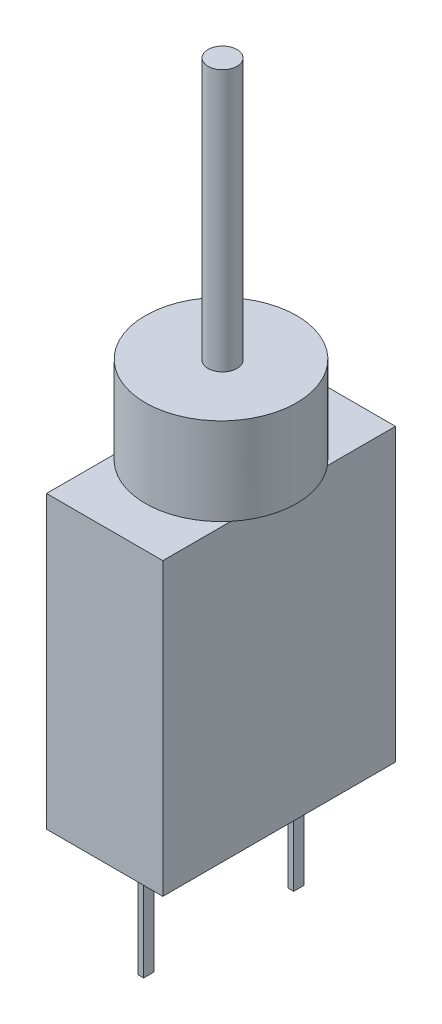
ISO-10303-21;
HEADER;
FILE_DESCRIPTION(('STEP AP214'),'2;1');
FILE_NAME('part.step','',(''),(''),'','','');
FILE_SCHEMA(('AUTOMOTIVE_DESIGN { 1 0 10303 214 1 1 1 1 }'));
ENDSEC;
DATA;
#1=APPLICATION_CONTEXT('core data for automotive mechanical design processes');
#2=APPLICATION_PROTOCOL_DEFINITION('international standard','automotive_design',2000,#1);
#3=PRODUCT_CONTEXT('',#1,'mechanical');
#4=PRODUCT('Part','Part','',(#3));
#5=PRODUCT_RELATED_PRODUCT_CATEGORY('part','',(#4));
#6=PRODUCT_DEFINITION_FORMATION('','',#4);
#7=PRODUCT_DEFINITION_CONTEXT('part definition',#1,'design');
#8=PRODUCT_DEFINITION('design','',#6,#7);
#9=PRODUCT_DEFINITION_SHAPE('','',#8);
#10=(LENGTH_UNIT() NAMED_UNIT(*) SI_UNIT(.MILLI.,.METRE.));
#11=(NAMED_UNIT(*) PLANE_ANGLE_UNIT() SI_UNIT($,.RADIAN.));
#12=(NAMED_UNIT(*) SI_UNIT($,.STERADIAN.) SOLID_ANGLE_UNIT());
#13=UNCERTAINTY_MEASURE_WITH_UNIT(LENGTH_MEASURE(1.E-05),#10,'distance_accuracy_value','');
#14=(GEOMETRIC_REPRESENTATION_CONTEXT(3) GLOBAL_UNCERTAINTY_ASSIGNED_CONTEXT((#13)) GLOBAL_UNIT_ASSIGNED_CONTEXT((#10,
#11,#12)) REPRESENTATION_CONTEXT('',''));
#15=CARTESIAN_POINT('',(0.,0.,0.));
#16=DIRECTION('',(0.,0.,1.));
#17=DIRECTION('',(1.,0.,0.));
#18=AXIS2_PLACEMENT_3D('',#15,#16,#17);
#19=CARTESIAN_POINT('',(4.,5.,4.));
#20=DIRECTION('',(0.,-1.,0.));
#21=DIRECTION('',(0.,0.,-1.));
#22=AXIS2_PLACEMENT_3D('',#19,#20,#21);
#23=PLANE('',#22);
#24=CARTESIAN_POINT('',(2.,5.,0.));
#25=DIRECTION('',(0.,1.,0.));
#26=DIRECTION('',(0.,0.,1.));
#27=AXIS2_PLACEMENT_3D('',#24,#25,#26);
#28=CIRCLE('',#27,2.6);
#29=CARTESIAN_POINT('',(4.,5.,-1.66132477258361));
#30=VERTEX_POINT('',#29);
#31=CARTESIAN_POINT('',(0.,5.,-1.66132477258361));
#32=VERTEX_POINT('',#31);
#33=EDGE_CURVE('E50',#30,#32,#28,.T.);
#34=ORIENTED_EDGE('',*,*,#33,.F.);
#35=DIRECTION('',(0.,0.,1.));
#36=VECTOR('',#35,1.);
#37=CARTESIAN_POINT('',(4.,5.,4.));
#38=LINE('',#37,#36);
#39=CARTESIAN_POINT('',(4.,5.,-4.));
#40=VERTEX_POINT('',#39);
#41=EDGE_CURVE('E149',#40,#30,#38,.T.);
#42=ORIENTED_EDGE('',*,*,#41,.F.);
#43=DIRECTION('',(-1.,0.,0.));
#44=VECTOR('',#43,1.);
#45=CARTESIAN_POINT('',(4.,5.,-4.));
#46=LINE('',#45,#44);
#47=CARTESIAN_POINT('',(0.,5.,-4.));
#48=VERTEX_POINT('',#47);
#49=EDGE_CURVE('E45',#40,#48,#46,.T.);
#50=ORIENTED_EDGE('',*,*,#49,.T.);
#51=DIRECTION('',(0.,0.,1.));
#52=VECTOR('',#51,1.);
#53=CARTESIAN_POINT('',(0.,5.,4.));
#54=LINE('',#53,#52);
#55=EDGE_CURVE('E249',#48,#32,#54,.T.);
#56=ORIENTED_EDGE('',*,*,#55,.T.);
#57=EDGE_LOOP('',(#34,#42,#50,#56));
#58=FACE_BOUND('',#57,.T.);
#59=ADVANCED_FACE('F41',(#58),#23,.F.);
#60=CARTESIAN_POINT('',(4.,-5.,4.));
#61=DIRECTION('',(0.,1.,0.));
#62=DIRECTION('',(0.,0.,1.));
#63=AXIS2_PLACEMENT_3D('',#60,#61,#62);
#64=PLANE('',#63);
#65=DIRECTION('',(1.,0.,0.));
#66=VECTOR('',#65,1.);
#67=CARTESIAN_POINT('',(1.89938215202544,-5.,-2.40076397000126));
#68=LINE('',#67,#66);
#69=CARTESIAN_POINT('',(1.89938215202544,-5.,-2.40076397000126));
#70=VERTEX_POINT('',#69);
#71=CARTESIAN_POINT('',(2.10061784797456,-5.,-2.40076397000126));
#72=VERTEX_POINT('',#71);
#73=EDGE_CURVE('E189',#70,#72,#68,.T.);
#74=ORIENTED_EDGE('',*,*,#73,.T.);
#75=DIRECTION('',(0.,0.,-1.));
#76=VECTOR('',#75,1.);
#77=CARTESIAN_POINT('',(2.10061784797456,-5.,-2.76066695370601));
#78=LINE('',#77,#76);
#79=CARTESIAN_POINT('',(2.10061784797456,-5.,-2.76066695370601));
#80=VERTEX_POINT('',#79);
#81=EDGE_CURVE('E169',#72,#80,#78,.T.);
#82=ORIENTED_EDGE('',*,*,#81,.T.);
#83=DIRECTION('',(-1.,0.,0.));
#84=VECTOR('',#83,1.);
#85=CARTESIAN_POINT('',(1.89938215202544,-5.,-2.76066695370601));
#86=LINE('',#85,#84);
#87=CARTESIAN_POINT('',(1.89938215202544,-5.,-2.76066695370601));
#88=VERTEX_POINT('',#87);
#89=EDGE_CURVE('E177',#80,#88,#86,.T.);
#90=ORIENTED_EDGE('',*,*,#89,.T.);
#91=DIRECTION('',(0.,0.,1.));
#92=VECTOR('',#91,1.);
#93=CARTESIAN_POINT('',(1.89938215202544,-5.,-2.76066695370601));
#94=LINE('',#93,#92);
#95=EDGE_CURVE('E192',#88,#70,#94,.T.);
#96=ORIENTED_EDGE('',*,*,#95,.T.);
#97=EDGE_LOOP('',(#74,#82,#90,#96));
#98=FACE_BOUND('',#97,.T.);
#99=DIRECTION('',(0.,0.,-1.));
#100=VECTOR('',#99,1.);
#101=CARTESIAN_POINT('',(0.,-5.,4.));
#102=LINE('',#101,#100);
#103=CARTESIAN_POINT('',(0.,-5.,4.));
#104=VERTEX_POINT('',#103);
#105=CARTESIAN_POINT('',(0.,-5.,-4.));
#106=VERTEX_POINT('',#105);
#107=EDGE_CURVE('E239',#104,#106,#102,.T.);
#108=ORIENTED_EDGE('',*,*,#107,.T.);
#109=DIRECTION('',(-1.,0.,0.));
#110=VECTOR('',#109,1.);
#111=CARTESIAN_POINT('',(4.,-5.,-4.));
#112=LINE('',#111,#110);
#113=CARTESIAN_POINT('',(4.,-5.,-4.));
#114=VERTEX_POINT('',#113);
#115=EDGE_CURVE('E245',#114,#106,#112,.T.);
#116=ORIENTED_EDGE('',*,*,#115,.F.);
#117=DIRECTION('',(0.,0.,-1.));
#118=VECTOR('',#117,1.);
#119=CARTESIAN_POINT('',(4.,-5.,4.));
#120=LINE('',#119,#118);
#121=CARTESIAN_POINT('',(4.,-5.,4.));
#122=VERTEX_POINT('',#121);
#123=EDGE_CURVE('E243',#122,#114,#120,.T.);
#124=ORIENTED_EDGE('',*,*,#123,.F.);
#125=DIRECTION('',(-1.,0.,0.));
#126=VECTOR('',#125,1.);
#127=CARTESIAN_POINT('',(4.,-5.,4.));
#128=LINE('',#127,#126);
#129=EDGE_CURVE('E257',#122,#104,#128,.T.);
#130=ORIENTED_EDGE('',*,*,#129,.T.);
#131=EDGE_LOOP('',(#108,#116,#124,#130));
#132=FACE_BOUND('',#131,.T.);
#133=DIRECTION('',(0.,0.,1.));
#134=VECTOR('',#133,1.);
#135=CARTESIAN_POINT('',(2.10061784797456,-5.,2.76066695370601));
#136=LINE('',#135,#134);
#137=CARTESIAN_POINT('',(2.10061784797456,-5.,2.40076397000126));
#138=VERTEX_POINT('',#137);
#139=CARTESIAN_POINT('',(2.10061784797456,-5.,2.76066695370601));
#140=VERTEX_POINT('',#139);
#141=EDGE_CURVE('E205',#138,#140,#136,.T.);
#142=ORIENTED_EDGE('',*,*,#141,.F.);
#143=DIRECTION('',(1.,0.,0.));
#144=VECTOR('',#143,1.);
#145=CARTESIAN_POINT('',(1.89938215202544,-5.,2.40076397000126));
#146=LINE('',#145,#144);
#147=CARTESIAN_POINT('',(1.89938215202544,-5.,2.40076397000126));
#148=VERTEX_POINT('',#147);
#149=EDGE_CURVE('E210',#148,#138,#146,.T.);
#150=ORIENTED_EDGE('',*,*,#149,.F.);
#151=DIRECTION('',(0.,0.,-1.));
#152=VECTOR('',#151,1.);
#153=CARTESIAN_POINT('',(1.89938215202544,-5.,2.76066695370601));
#154=LINE('',#153,#152);
#155=CARTESIAN_POINT('',(1.89938215202544,-5.,2.76066695370601));
#156=VERTEX_POINT('',#155);
#157=EDGE_CURVE('E222',#156,#148,#154,.T.);
#158=ORIENTED_EDGE('',*,*,#157,.F.);
#159=DIRECTION('',(-1.,0.,0.));
#160=VECTOR('',#159,1.);
#161=CARTESIAN_POINT('',(1.89938215202544,-5.,2.76066695370601));
#162=LINE('',#161,#160);
#163=EDGE_CURVE('E219',#140,#156,#162,.T.);
#164=ORIENTED_EDGE('',*,*,#163,.F.);
#165=EDGE_LOOP('',(#142,#150,#158,#164));
#166=FACE_BOUND('',#165,.T.);
#167=ADVANCED_FACE('F290',(#98,#132,#166),#64,.F.);
#168=CARTESIAN_POINT('',(4.,5.,-4.));
#169=DIRECTION('',(0.,0.,1.));
#170=DIRECTION('',(0.,-1.,0.));
#171=AXIS2_PLACEMENT_3D('',#168,#169,#170);
#172=PLANE('',#171);
#173=DIRECTION('',(0.,1.,0.));
#174=VECTOR('',#173,1.);
#175=CARTESIAN_POINT('',(0.,5.,-4.));
#176=LINE('',#175,#174);
#177=EDGE_CURVE('E238',#106,#48,#176,.T.);
#178=ORIENTED_EDGE('',*,*,#177,.T.);
#179=ORIENTED_EDGE('',*,*,#49,.F.);
#180=DIRECTION('',(0.,1.,0.));
#181=VECTOR('',#180,1.);
#182=CARTESIAN_POINT('',(4.,5.,-4.));
#183=LINE('',#182,#181);
#184=EDGE_CURVE('E158',#114,#40,#183,.T.);
#185=ORIENTED_EDGE('',*,*,#184,.F.);
#186=ORIENTED_EDGE('',*,*,#115,.T.);
#187=EDGE_LOOP('',(#178,#179,#185,#186));
#188=FACE_BOUND('',#187,.T.);
#189=ADVANCED_FACE('F43',(#188),#172,.F.);
#190=CARTESIAN_POINT('',(0.,5.,1.66132477258361));
#191=VERTEX_POINT('',#190);
#192=CARTESIAN_POINT('',(4.,5.,1.66132477258361));
#193=VERTEX_POINT('',#192);
#194=EDGE_CURVE('E65',#191,#193,#28,.T.);
#195=ORIENTED_EDGE('',*,*,#194,.F.);
#196=CARTESIAN_POINT('',(0.,5.,4.));
#197=VERTEX_POINT('',#196);
#198=EDGE_CURVE('E248',#191,#197,#54,.T.);
#199=ORIENTED_EDGE('',*,*,#198,.T.);
#200=DIRECTION('',(-1.,0.,0.));
#201=VECTOR('',#200,1.);
#202=CARTESIAN_POINT('',(4.,5.,4.));
#203=LINE('',#202,#201);
#204=CARTESIAN_POINT('',(4.,5.,4.));
#205=VERTEX_POINT('',#204);
#206=EDGE_CURVE('E156',#205,#197,#203,.T.);
#207=ORIENTED_EDGE('',*,*,#206,.F.);
#208=EDGE_CURVE('E147',#193,#205,#38,.T.);
#209=ORIENTED_EDGE('',*,*,#208,.F.);
#210=EDGE_LOOP('',(#195,#199,#207,#209));
#211=FACE_BOUND('',#210,.T.);
#212=ADVANCED_FACE('F154',(#211),#23,.F.);
#213=CARTESIAN_POINT('',(4.,5.,4.));
#214=DIRECTION('',(0.,0.,-1.));
#215=DIRECTION('',(0.,1.,0.));
#216=AXIS2_PLACEMENT_3D('',#213,#214,#215);
#217=PLANE('',#216);
#218=DIRECTION('',(0.,-1.,0.));
#219=VECTOR('',#218,1.);
#220=CARTESIAN_POINT('',(0.,5.,4.));
#221=LINE('',#220,#219);
#222=EDGE_CURVE('E251',#197,#104,#221,.T.);
#223=ORIENTED_EDGE('',*,*,#222,.T.);
#224=ORIENTED_EDGE('',*,*,#129,.F.);
#225=DIRECTION('',(0.,-1.,0.));
#226=VECTOR('',#225,1.);
#227=CARTESIAN_POINT('',(4.,5.,4.));
#228=LINE('',#227,#226);
#229=EDGE_CURVE('E241',#205,#122,#228,.T.);
#230=ORIENTED_EDGE('',*,*,#229,.F.);
#231=ORIENTED_EDGE('',*,*,#206,.T.);
#232=EDGE_LOOP('',(#223,#224,#230,#231));
#233=FACE_BOUND('',#232,.T.);
#234=ADVANCED_FACE('F298',(#233),#217,.F.);
#235=CARTESIAN_POINT('',(4.,0.,0.));
#236=DIRECTION('',(1.,0.,0.));
#237=DIRECTION('',(0.,0.,-1.));
#238=AXIS2_PLACEMENT_3D('',#235,#236,#237);
#239=PLANE('',#238);
#240=ORIENTED_EDGE('',*,*,#184,.T.);
#241=ORIENTED_EDGE('',*,*,#41,.T.);
#242=EDGE_CURVE('E144',#30,#193,#38,.T.);
#243=ORIENTED_EDGE('',*,*,#242,.T.);
#244=ORIENTED_EDGE('',*,*,#208,.T.);
#245=ORIENTED_EDGE('',*,*,#229,.T.);
#246=ORIENTED_EDGE('',*,*,#123,.T.);
#247=EDGE_LOOP('',(#240,#241,#243,#244,#245,#246));
#248=FACE_BOUND('',#247,.T.);
#249=ADVANCED_FACE('F146',(#248),#239,.T.);
#250=CARTESIAN_POINT('',(0.,0.,0.));
#251=DIRECTION('',(1.,0.,0.));
#252=DIRECTION('',(0.,0.,-1.));
#253=AXIS2_PLACEMENT_3D('',#250,#251,#252);
#254=PLANE('',#253);
#255=ORIENTED_EDGE('',*,*,#177,.F.);
#256=ORIENTED_EDGE('',*,*,#107,.F.);
#257=ORIENTED_EDGE('',*,*,#222,.F.);
#258=ORIENTED_EDGE('',*,*,#198,.F.);
#259=EDGE_CURVE('E252',#32,#191,#54,.T.);
#260=ORIENTED_EDGE('',*,*,#259,.F.);
#261=ORIENTED_EDGE('',*,*,#55,.F.);
#262=EDGE_LOOP('',(#255,#256,#257,#258,#260,#261));
#263=FACE_BOUND('',#262,.T.);
#264=ADVANCED_FACE('F269',(#263),#254,.F.);
#265=CARTESIAN_POINT('',(2.10061784797456,-9.,2.76066695370601));
#266=DIRECTION('',(-1.,0.,0.));
#267=DIRECTION('',(0.,0.,1.));
#268=AXIS2_PLACEMENT_3D('',#265,#266,#267);
#269=PLANE('',#268);
#270=ORIENTED_EDGE('',*,*,#141,.T.);
#271=DIRECTION('',(0.,1.,0.));
#272=VECTOR('',#271,1.);
#273=CARTESIAN_POINT('',(2.10061784797456,-9.,2.76066695370601));
#274=LINE('',#273,#272);
#275=CARTESIAN_POINT('',(2.10061784797456,-9.,2.76066695370601));
#276=VERTEX_POINT('',#275);
#277=EDGE_CURVE('E235',#276,#140,#274,.T.);
#278=ORIENTED_EDGE('',*,*,#277,.F.);
#279=DIRECTION('',(0.,0.,1.));
#280=VECTOR('',#279,1.);
#281=CARTESIAN_POINT('',(2.10061784797456,-9.,2.76066695370601));
#282=LINE('',#281,#280);
#283=CARTESIAN_POINT('',(2.10061784797456,-9.,2.40076397000126));
#284=VERTEX_POINT('',#283);
#285=EDGE_CURVE('E206',#284,#276,#282,.T.);
#286=ORIENTED_EDGE('',*,*,#285,.F.);
#287=DIRECTION('',(0.,1.,0.));
#288=VECTOR('',#287,1.);
#289=CARTESIAN_POINT('',(2.10061784797456,-9.,2.40076397000126));
#290=LINE('',#289,#288);
#291=EDGE_CURVE('E216',#284,#138,#290,.T.);
#292=ORIENTED_EDGE('',*,*,#291,.T.);
#293=EDGE_LOOP('',(#270,#278,#286,#292));
#294=FACE_BOUND('',#293,.T.);
#295=ADVANCED_FACE('F388',(#294),#269,.F.);
#296=CARTESIAN_POINT('',(1.89938215202544,-9.,2.76066695370601));
#297=DIRECTION('',(0.,0.,-1.));
#298=DIRECTION('',(-1.,0.,0.));
#299=AXIS2_PLACEMENT_3D('',#296,#297,#298);
#300=PLANE('',#299);
#301=ORIENTED_EDGE('',*,*,#163,.T.);
#302=DIRECTION('',(0.,1.,0.));
#303=VECTOR('',#302,1.);
#304=CARTESIAN_POINT('',(1.89938215202544,-9.,2.76066695370601));
#305=LINE('',#304,#303);
#306=CARTESIAN_POINT('',(1.89938215202544,-9.,2.76066695370601));
#307=VERTEX_POINT('',#306);
#308=EDGE_CURVE('E232',#307,#156,#305,.T.);
#309=ORIENTED_EDGE('',*,*,#308,.F.);
#310=DIRECTION('',(-1.,0.,0.));
#311=VECTOR('',#310,1.);
#312=CARTESIAN_POINT('',(1.89938215202544,-9.,2.76066695370601));
#313=LINE('',#312,#311);
#314=EDGE_CURVE('E209',#276,#307,#313,.T.);
#315=ORIENTED_EDGE('',*,*,#314,.F.);
#316=ORIENTED_EDGE('',*,*,#277,.T.);
#317=EDGE_LOOP('',(#301,#309,#315,#316));
#318=FACE_BOUND('',#317,.T.);
#319=ADVANCED_FACE('F446',(#318),#300,.F.);
#320=CARTESIAN_POINT('',(1.89938215202544,-9.,2.76066695370601));
#321=DIRECTION('',(1.,0.,0.));
#322=DIRECTION('',(0.,0.,-1.));
#323=AXIS2_PLACEMENT_3D('',#320,#321,#322);
#324=PLANE('',#323);
#325=ORIENTED_EDGE('',*,*,#157,.T.);
#326=DIRECTION('',(0.,1.,0.));
#327=VECTOR('',#326,1.);
#328=CARTESIAN_POINT('',(1.89938215202544,-9.,2.40076397000126));
#329=LINE('',#328,#327);
#330=CARTESIAN_POINT('',(1.89938215202544,-9.,2.40076397000126));
#331=VERTEX_POINT('',#330);
#332=EDGE_CURVE('E229',#331,#148,#329,.T.);
#333=ORIENTED_EDGE('',*,*,#332,.F.);
#334=DIRECTION('',(0.,0.,-1.));
#335=VECTOR('',#334,1.);
#336=CARTESIAN_POINT('',(1.89938215202544,-9.,2.76066695370601));
#337=LINE('',#336,#335);
#338=EDGE_CURVE('E212',#307,#331,#337,.T.);
#339=ORIENTED_EDGE('',*,*,#338,.F.);
#340=ORIENTED_EDGE('',*,*,#308,.T.);
#341=EDGE_LOOP('',(#325,#333,#339,#340));
#342=FACE_BOUND('',#341,.T.);
#343=ADVANCED_FACE('F453',(#342),#324,.F.);
#344=CARTESIAN_POINT('',(1.89938215202544,-9.,2.40076397000126));
#345=DIRECTION('',(0.,0.,1.));
#346=DIRECTION('',(1.,0.,0.));
#347=AXIS2_PLACEMENT_3D('',#344,#345,#346);
#348=PLANE('',#347);
#349=ORIENTED_EDGE('',*,*,#149,.T.);
#350=ORIENTED_EDGE('',*,*,#291,.F.);
#351=DIRECTION('',(1.,0.,0.));
#352=VECTOR('',#351,1.);
#353=CARTESIAN_POINT('',(1.89938215202544,-9.,2.40076397000126));
#354=LINE('',#353,#352);
#355=EDGE_CURVE('E214',#331,#284,#354,.T.);
#356=ORIENTED_EDGE('',*,*,#355,.F.);
#357=ORIENTED_EDGE('',*,*,#332,.T.);
#358=EDGE_LOOP('',(#349,#350,#356,#357));
#359=FACE_BOUND('',#358,.T.);
#360=ADVANCED_FACE('F461',(#359),#348,.F.);
#361=CARTESIAN_POINT('',(0.,-9.,0.));
#362=DIRECTION('',(0.,-1.,0.));
#363=DIRECTION('',(0.,0.,-1.));
#364=AXIS2_PLACEMENT_3D('',#361,#362,#363);
#365=PLANE('',#364);
#366=ORIENTED_EDGE('',*,*,#285,.T.);
#367=ORIENTED_EDGE('',*,*,#314,.T.);
#368=ORIENTED_EDGE('',*,*,#338,.T.);
#369=ORIENTED_EDGE('',*,*,#355,.T.);
#370=EDGE_LOOP('',(#366,#367,#368,#369));
#371=FACE_BOUND('',#370,.T.);
#372=ADVANCED_FACE('F318',(#371),#365,.T.);
#373=CARTESIAN_POINT('',(2.10061784797456,-9.,-2.76066695370601));
#374=DIRECTION('',(1.,0.,0.));
#375=DIRECTION('',(0.,0.,-1.));
#376=AXIS2_PLACEMENT_3D('',#373,#374,#375);
#377=PLANE('',#376);
#378=ORIENTED_EDGE('',*,*,#81,.F.);
#379=DIRECTION('',(0.,1.,0.));
#380=VECTOR('',#379,1.);
#381=CARTESIAN_POINT('',(2.10061784797456,-9.,-2.40076397000126));
#382=LINE('',#381,#380);
#383=CARTESIAN_POINT('',(2.10061784797456,-9.,-2.40076397000126));
#384=VERTEX_POINT('',#383);
#385=EDGE_CURVE('E203',#384,#72,#382,.T.);
#386=ORIENTED_EDGE('',*,*,#385,.F.);
#387=DIRECTION('',(0.,0.,-1.));
#388=VECTOR('',#387,1.);
#389=CARTESIAN_POINT('',(2.10061784797456,-9.,-2.76066695370601));
#390=LINE('',#389,#388);
#391=CARTESIAN_POINT('',(2.10061784797456,-9.,-2.76066695370601));
#392=VERTEX_POINT('',#391);
#393=EDGE_CURVE('E173',#384,#392,#390,.T.);
#394=ORIENTED_EDGE('',*,*,#393,.T.);
#395=DIRECTION('',(0.,1.,0.));
#396=VECTOR('',#395,1.);
#397=CARTESIAN_POINT('',(2.10061784797456,-9.,-2.76066695370601));
#398=LINE('',#397,#396);
#399=EDGE_CURVE('E186',#392,#80,#398,.T.);
#400=ORIENTED_EDGE('',*,*,#399,.T.);
#401=EDGE_LOOP('',(#378,#386,#394,#400));
#402=FACE_BOUND('',#401,.T.);
#403=ADVANCED_FACE('F323',(#402),#377,.T.);
#404=CARTESIAN_POINT('',(1.89938215202544,-9.,-2.40076397000126));
#405=DIRECTION('',(0.,0.,1.));
#406=DIRECTION('',(1.,0.,0.));
#407=AXIS2_PLACEMENT_3D('',#404,#405,#406);
#408=PLANE('',#407);
#409=ORIENTED_EDGE('',*,*,#73,.F.);
#410=DIRECTION('',(0.,1.,0.));
#411=VECTOR('',#410,1.);
#412=CARTESIAN_POINT('',(1.89938215202544,-9.,-2.40076397000126));
#413=LINE('',#412,#411);
#414=CARTESIAN_POINT('',(1.89938215202544,-9.,-2.40076397000126));
#415=VERTEX_POINT('',#414);
#416=EDGE_CURVE('E201',#415,#70,#413,.T.);
#417=ORIENTED_EDGE('',*,*,#416,.F.);
#418=DIRECTION('',(1.,0.,0.));
#419=VECTOR('',#418,1.);
#420=CARTESIAN_POINT('',(1.89938215202544,-9.,-2.40076397000126));
#421=LINE('',#420,#419);
#422=EDGE_CURVE('E176',#415,#384,#421,.T.);
#423=ORIENTED_EDGE('',*,*,#422,.T.);
#424=ORIENTED_EDGE('',*,*,#385,.T.);
#425=EDGE_LOOP('',(#409,#417,#423,#424));
#426=FACE_BOUND('',#425,.T.);
#427=ADVANCED_FACE('F328',(#426),#408,.T.);
#428=CARTESIAN_POINT('',(1.89938215202544,-9.,-2.76066695370601));
#429=DIRECTION('',(-1.,0.,0.));
#430=DIRECTION('',(0.,0.,1.));
#431=AXIS2_PLACEMENT_3D('',#428,#429,#430);
#432=PLANE('',#431);
#433=ORIENTED_EDGE('',*,*,#95,.F.);
#434=DIRECTION('',(0.,1.,0.));
#435=VECTOR('',#434,1.);
#436=CARTESIAN_POINT('',(1.89938215202544,-9.,-2.76066695370601));
#437=LINE('',#436,#435);
#438=CARTESIAN_POINT('',(1.89938215202544,-9.,-2.76066695370601));
#439=VERTEX_POINT('',#438);
#440=EDGE_CURVE('E198',#439,#88,#437,.T.);
#441=ORIENTED_EDGE('',*,*,#440,.F.);
#442=DIRECTION('',(0.,0.,1.));
#443=VECTOR('',#442,1.);
#444=CARTESIAN_POINT('',(1.89938215202544,-9.,-2.76066695370601));
#445=LINE('',#444,#443);
#446=EDGE_CURVE('E180',#439,#415,#445,.T.);
#447=ORIENTED_EDGE('',*,*,#446,.T.);
#448=ORIENTED_EDGE('',*,*,#416,.T.);
#449=EDGE_LOOP('',(#433,#441,#447,#448));
#450=FACE_BOUND('',#449,.T.);
#451=ADVANCED_FACE('F338',(#450),#432,.T.);
#452=CARTESIAN_POINT('',(1.89938215202544,-9.,-2.76066695370601));
#453=DIRECTION('',(0.,0.,-1.));
#454=DIRECTION('',(-1.,0.,0.));
#455=AXIS2_PLACEMENT_3D('',#452,#453,#454);
#456=PLANE('',#455);
#457=ORIENTED_EDGE('',*,*,#89,.F.);
#458=ORIENTED_EDGE('',*,*,#399,.F.);
#459=DIRECTION('',(-1.,0.,0.));
#460=VECTOR('',#459,1.);
#461=CARTESIAN_POINT('',(1.89938215202544,-9.,-2.76066695370601));
#462=LINE('',#461,#460);
#463=EDGE_CURVE('E183',#392,#439,#462,.T.);
#464=ORIENTED_EDGE('',*,*,#463,.T.);
#465=ORIENTED_EDGE('',*,*,#440,.T.);
#466=EDGE_LOOP('',(#457,#458,#464,#465));
#467=FACE_BOUND('',#466,.T.);
#468=ADVANCED_FACE('F283',(#467),#456,.T.);
#469=CARTESIAN_POINT('',(0.,-9.,0.));
#470=DIRECTION('',(0.,-1.,0.));
#471=DIRECTION('',(0.,0.,1.));
#472=AXIS2_PLACEMENT_3D('',#469,#470,#471);
#473=PLANE('',#472);
#474=ORIENTED_EDGE('',*,*,#393,.F.);
#475=ORIENTED_EDGE('',*,*,#422,.F.);
#476=ORIENTED_EDGE('',*,*,#446,.F.);
#477=ORIENTED_EDGE('',*,*,#463,.F.);
#478=EDGE_LOOP('',(#474,#475,#476,#477));
#479=FACE_BOUND('',#478,.T.);
#480=ADVANCED_FACE('F274',(#479),#473,.T.);
#481=CARTESIAN_POINT('',(2.,5.,0.));
#482=DIRECTION('',(0.,1.,0.));
#483=DIRECTION('',(0.,0.,1.));
#484=AXIS2_PLACEMENT_3D('',#481,#482,#483);
#485=PLANE('',#484);
#486=EDGE_CURVE('E164',#32,#191,#28,.T.);
#487=ORIENTED_EDGE('',*,*,#486,.F.);
#488=ORIENTED_EDGE('',*,*,#259,.T.);
#489=EDGE_LOOP('',(#487,#488));
#490=FACE_BOUND('',#489,.T.);
#491=ADVANCED_FACE('F272',(#490),#485,.F.);
#492=CARTESIAN_POINT('',(2.,8.,0.));
#493=DIRECTION('',(0.,-1.,0.));
#494=DIRECTION('',(0.,0.,-1.));
#495=AXIS2_PLACEMENT_3D('',#492,#493,#494);
#496=CYLINDRICAL_SURFACE('',#495,2.6);
#497=CARTESIAN_POINT('',(2.,8.,0.));
#498=DIRECTION('',(0.,1.,0.));
#499=DIRECTION('',(0.,0.,1.));
#500=AXIS2_PLACEMENT_3D('',#497,#498,#499);
#501=CIRCLE('',#500,2.6);
#502=CARTESIAN_POINT('',(2.,8.,2.6));
#503=VERTEX_POINT('',#502);
#504=EDGE_CURVE('E167',#503,#503,#501,.T.);
#505=ORIENTED_EDGE('',*,*,#504,.F.);
#506=EDGE_LOOP('',(#505));
#507=FACE_BOUND('',#506,.T.);
#508=EDGE_CURVE('E162',#193,#30,#28,.T.);
#509=ORIENTED_EDGE('',*,*,#508,.T.);
#510=ORIENTED_EDGE('',*,*,#33,.T.);
#511=ORIENTED_EDGE('',*,*,#486,.T.);
#512=ORIENTED_EDGE('',*,*,#194,.T.);
#513=EDGE_LOOP('',(#509,#510,#511,#512));
#514=FACE_BOUND('',#513,.T.);
#515=ADVANCED_FACE('F161',(#507,#514),#496,.T.);
#516=CARTESIAN_POINT('',(2.,8.,0.));
#517=DIRECTION('',(0.,1.,0.));
#518=DIRECTION('',(0.,0.,1.));
#519=AXIS2_PLACEMENT_3D('',#516,#517,#518);
#520=PLANE('',#519);
#521=CARTESIAN_POINT('',(2.05354167738546,8.,0.));
#522=DIRECTION('',(0.,1.,0.));
#523=DIRECTION('',(0.,0.,1.));
#524=AXIS2_PLACEMENT_3D('',#521,#522,#523);
#525=CIRCLE('',#524,0.5);
#526=CARTESIAN_POINT('',(2.05354167738546,8.,0.5));
#527=VERTEX_POINT('',#526);
#528=EDGE_CURVE('E11',#527,#527,#525,.T.);
#529=ORIENTED_EDGE('',*,*,#528,.F.);
#530=EDGE_LOOP('',(#529));
#531=FACE_BOUND('',#530,.T.);
#532=ORIENTED_EDGE('',*,*,#504,.T.);
#533=EDGE_LOOP('',(#532));
#534=FACE_BOUND('',#533,.T.);
#535=ADVANCED_FACE('F280',(#531,#534),#520,.T.);
#536=ORIENTED_EDGE('',*,*,#242,.F.);
#537=ORIENTED_EDGE('',*,*,#508,.F.);
#538=EDGE_LOOP('',(#536,#537));
#539=FACE_BOUND('',#538,.T.);
#540=ADVANCED_FACE('F166',(#539),#485,.F.);
#541=CARTESIAN_POINT('',(2.05354167738546,17.,0.));
#542=DIRECTION('',(0.,-1.,0.));
#543=DIRECTION('',(0.,0.,-1.));
#544=AXIS2_PLACEMENT_3D('',#541,#542,#543);
#545=CYLINDRICAL_SURFACE('',#544,0.5);
#546=CARTESIAN_POINT('',(2.05354167738546,17.,0.));
#547=DIRECTION('',(0.,1.,0.));
#548=DIRECTION('',(0.,0.,1.));
#549=AXIS2_PLACEMENT_3D('',#546,#547,#548);
#550=CIRCLE('',#549,0.5);
#551=CARTESIAN_POINT('',(2.05354167738546,17.,0.5));
#552=VERTEX_POINT('',#551);
#553=EDGE_CURVE('E171',#552,#552,#550,.T.);
#554=ORIENTED_EDGE('',*,*,#553,.F.);
#555=EDGE_LOOP('',(#554));
#556=FACE_BOUND('',#555,.T.);
#557=ORIENTED_EDGE('',*,*,#528,.T.);
#558=EDGE_LOOP('',(#557));
#559=FACE_BOUND('',#558,.T.);
#560=ADVANCED_FACE('F288',(#556,#559),#545,.T.);
#561=CARTESIAN_POINT('',(2.05354167738546,17.,0.));
#562=DIRECTION('',(0.,1.,0.));
#563=DIRECTION('',(0.,0.,1.));
#564=AXIS2_PLACEMENT_3D('',#561,#562,#563);
#565=PLANE('',#564);
#566=ORIENTED_EDGE('',*,*,#553,.T.);
#567=EDGE_LOOP('',(#566));
#568=FACE_BOUND('',#567,.T.);
#569=ADVANCED_FACE('F422',(#568),#565,.T.);
#570=CLOSED_SHELL('',(#59,#167,#189,#212,#234,#249,#264,#295,#319,#343,#360,#372,#403,#427,#451,
#468,#480,#491,#515,#535,#540,#560,#569));
#571=MANIFOLD_SOLID_BREP('B2',#570);
#572=ADVANCED_BREP_SHAPE_REPRESENTATION('',(#18,#571),#14);
#573=SHAPE_DEFINITION_REPRESENTATION(#9,#572);
ENDSEC;
END-ISO-10303-21;
